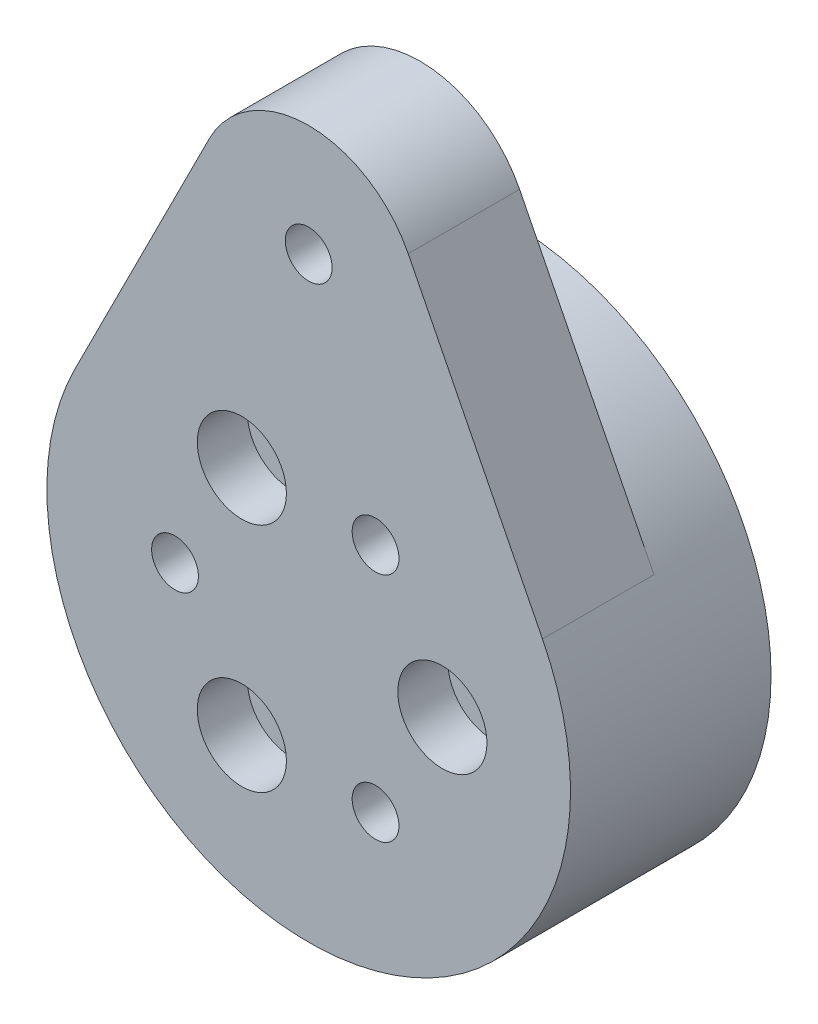
ISO-10303-21;
HEADER;
FILE_DESCRIPTION(('STEP AP214'),'2;1');
FILE_NAME('part.step','',(''),(''),'','','');
FILE_SCHEMA(('AUTOMOTIVE_DESIGN { 1 0 10303 214 1 1 1 1 }'));
ENDSEC;
DATA;
#1=APPLICATION_CONTEXT('core data for automotive mechanical design processes');
#2=APPLICATION_PROTOCOL_DEFINITION('international standard','automotive_design',2000,#1);
#3=PRODUCT_CONTEXT('',#1,'mechanical');
#4=PRODUCT('Part','Part','',(#3));
#5=PRODUCT_RELATED_PRODUCT_CATEGORY('part','',(#4));
#6=PRODUCT_DEFINITION_FORMATION('','',#4);
#7=PRODUCT_DEFINITION_CONTEXT('part definition',#1,'design');
#8=PRODUCT_DEFINITION('design','',#6,#7);
#9=PRODUCT_DEFINITION_SHAPE('','',#8);
#10=(LENGTH_UNIT() NAMED_UNIT(*) SI_UNIT(.MILLI.,.METRE.));
#11=(NAMED_UNIT(*) PLANE_ANGLE_UNIT() SI_UNIT($,.RADIAN.));
#12=(NAMED_UNIT(*) SI_UNIT($,.STERADIAN.) SOLID_ANGLE_UNIT());
#13=UNCERTAINTY_MEASURE_WITH_UNIT(LENGTH_MEASURE(1.E-05),#10,'distance_accuracy_value','');
#14=(GEOMETRIC_REPRESENTATION_CONTEXT(3) GLOBAL_UNCERTAINTY_ASSIGNED_CONTEXT((#13)) GLOBAL_UNIT_ASSIGNED_CONTEXT((#10,
#11,#12)) REPRESENTATION_CONTEXT('',''));
#15=CARTESIAN_POINT('',(0.,0.,0.));
#16=DIRECTION('',(0.,0.,1.));
#17=DIRECTION('',(1.,0.,0.));
#18=AXIS2_PLACEMENT_3D('',#15,#16,#17);
#19=CARTESIAN_POINT('',(12.,0.,0.));
#20=DIRECTION('',(0.,0.,1.));
#21=DIRECTION('',(1.,0.,0.));
#22=AXIS2_PLACEMENT_3D('',#19,#20,#21);
#23=CYLINDRICAL_SURFACE('',#22,2.25);
#24=CARTESIAN_POINT('',(12.,0.,0.));
#25=DIRECTION('',(0.,0.,1.));
#26=DIRECTION('',(1.,0.,0.));
#27=AXIS2_PLACEMENT_3D('',#24,#25,#26);
#28=CIRCLE('',#27,2.25);
#29=CARTESIAN_POINT('',(14.25,0.,0.));
#30=VERTEX_POINT('',#29);
#31=EDGE_CURVE('E127',#30,#30,#28,.T.);
#32=ORIENTED_EDGE('',*,*,#31,.F.);
#33=EDGE_LOOP('',(#32));
#34=FACE_BOUND('',#33,.T.);
#35=CARTESIAN_POINT('',(12.,0.,13.5));
#36=DIRECTION('',(0.,0.,1.));
#37=DIRECTION('',(1.,0.,0.));
#38=AXIS2_PLACEMENT_3D('',#35,#36,#37);
#39=CIRCLE('',#38,2.25);
#40=CARTESIAN_POINT('',(14.25,0.,13.5));
#41=VERTEX_POINT('',#40);
#42=EDGE_CURVE('E45',#41,#41,#39,.F.);
#43=ORIENTED_EDGE('',*,*,#42,.F.);
#44=EDGE_LOOP('',(#43));
#45=FACE_BOUND('',#44,.T.);
#46=ADVANCED_FACE('F41',(#34,#45),#23,.F.);
#47=CARTESIAN_POINT('',(-6.,-10.3923048454133,0.));
#48=DIRECTION('',(0.,0.,1.));
#49=DIRECTION('',(1.,0.,0.));
#50=AXIS2_PLACEMENT_3D('',#47,#48,#49);
#51=CYLINDRICAL_SURFACE('',#50,2.25);
#52=CARTESIAN_POINT('',(-6.,-10.3923048454133,0.));
#53=DIRECTION('',(0.,0.,1.));
#54=DIRECTION('',(1.,0.,0.));
#55=AXIS2_PLACEMENT_3D('',#52,#53,#54);
#56=CIRCLE('',#55,2.25);
#57=CARTESIAN_POINT('',(-3.75,-10.3923048454133,0.));
#58=VERTEX_POINT('',#57);
#59=EDGE_CURVE('E131',#58,#58,#56,.T.);
#60=ORIENTED_EDGE('',*,*,#59,.F.);
#61=EDGE_LOOP('',(#60));
#62=FACE_BOUND('',#61,.T.);
#63=CARTESIAN_POINT('',(-6.,-10.3923048454133,13.5));
#64=DIRECTION('',(0.,0.,1.));
#65=DIRECTION('',(1.,0.,0.));
#66=AXIS2_PLACEMENT_3D('',#63,#64,#65);
#67=CIRCLE('',#66,2.25);
#68=CARTESIAN_POINT('',(-3.75,-10.3923048454133,13.5));
#69=VERTEX_POINT('',#68);
#70=EDGE_CURVE('E121',#69,#69,#67,.F.);
#71=ORIENTED_EDGE('',*,*,#70,.F.);
#72=EDGE_LOOP('',(#71));
#73=FACE_BOUND('',#72,.T.);
#74=ADVANCED_FACE('F224',(#62,#73),#51,.F.);
#75=CARTESIAN_POINT('',(-6.00000000000001,10.3923048454133,0.));
#76=DIRECTION('',(0.,0.,1.));
#77=DIRECTION('',(1.,0.,0.));
#78=AXIS2_PLACEMENT_3D('',#75,#76,#77);
#79=CYLINDRICAL_SURFACE('',#78,2.25);
#80=CARTESIAN_POINT('',(-6.00000000000001,10.3923048454133,0.));
#81=DIRECTION('',(0.,0.,1.));
#82=DIRECTION('',(1.,0.,0.));
#83=AXIS2_PLACEMENT_3D('',#80,#81,#82);
#84=CIRCLE('',#83,2.25);
#85=CARTESIAN_POINT('',(-3.75,10.3923048454133,0.));
#86=VERTEX_POINT('',#85);
#87=EDGE_CURVE('E110',#86,#86,#84,.T.);
#88=ORIENTED_EDGE('',*,*,#87,.F.);
#89=EDGE_LOOP('',(#88));
#90=FACE_BOUND('',#89,.T.);
#91=CARTESIAN_POINT('',(-6.00000000000001,10.3923048454133,13.5));
#92=DIRECTION('',(0.,0.,1.));
#93=DIRECTION('',(1.,0.,0.));
#94=AXIS2_PLACEMENT_3D('',#91,#92,#93);
#95=CIRCLE('',#94,2.25);
#96=CARTESIAN_POINT('',(-3.75,10.3923048454133,13.5));
#97=VERTEX_POINT('',#96);
#98=EDGE_CURVE('E119',#97,#97,#95,.F.);
#99=ORIENTED_EDGE('',*,*,#98,.F.);
#100=EDGE_LOOP('',(#99));
#101=FACE_BOUND('',#100,.T.);
#102=ADVANCED_FACE('F230',(#90,#101),#79,.F.);
#103=CARTESIAN_POINT('',(0.,0.,18.));
#104=DIRECTION('',(0.,0.,-1.));
#105=DIRECTION('',(-1.,0.,0.));
#106=AXIS2_PLACEMENT_3D('',#103,#104,#105);
#107=CYLINDRICAL_SURFACE('',#106,23.5);
#108=CARTESIAN_POINT('',(0.,0.,18.));
#109=DIRECTION('',(0.,0.,1.));
#110=DIRECTION('',(1.,0.,0.));
#111=AXIS2_PLACEMENT_3D('',#108,#109,#110);
#112=CIRCLE('',#111,23.5);
#113=CARTESIAN_POINT('',(-20.9861710419028,10.575,18.));
#114=VERTEX_POINT('',#113);
#115=CARTESIAN_POINT('',(20.9861710419028,10.575,18.));
#116=VERTEX_POINT('',#115);
#117=EDGE_CURVE('E11',#114,#116,#112,.T.);
#118=ORIENTED_EDGE('',*,*,#117,.F.);
#119=DIRECTION('',(0.,0.,1.));
#120=VECTOR('',#119,1.);
#121=CARTESIAN_POINT('',(-20.9861710419028,10.575,8.));
#122=LINE('',#121,#120);
#123=CARTESIAN_POINT('',(-20.9861710419028,10.575,8.));
#124=VERTEX_POINT('',#123);
#125=EDGE_CURVE('E113',#124,#114,#122,.T.);
#126=ORIENTED_EDGE('',*,*,#125,.F.);
#127=CARTESIAN_POINT('',(0.,0.,8.));
#128=DIRECTION('',(0.,0.,1.));
#129=DIRECTION('',(1.,0.,0.));
#130=AXIS2_PLACEMENT_3D('',#127,#128,#129);
#131=CIRCLE('',#130,23.5);
#132=CARTESIAN_POINT('',(20.9861710419028,10.575,8.));
#133=VERTEX_POINT('',#132);
#134=EDGE_CURVE('E66',#133,#124,#131,.T.);
#135=ORIENTED_EDGE('',*,*,#134,.F.);
#136=DIRECTION('',(0.,0.,1.));
#137=VECTOR('',#136,1.);
#138=CARTESIAN_POINT('',(20.9861710419028,10.575,8.));
#139=LINE('',#138,#137);
#140=EDGE_CURVE('E97',#133,#116,#139,.T.);
#141=ORIENTED_EDGE('',*,*,#140,.T.);
#142=EDGE_LOOP('',(#118,#126,#135,#141));
#143=FACE_BOUND('',#142,.T.);
#144=CARTESIAN_POINT('',(0.,0.,0.));
#145=DIRECTION('',(0.,0.,1.));
#146=DIRECTION('',(1.,0.,0.));
#147=AXIS2_PLACEMENT_3D('',#144,#145,#146);
#148=CIRCLE('',#147,23.5);
#149=CARTESIAN_POINT('',(23.5,0.,0.));
#150=VERTEX_POINT('',#149);
#151=EDGE_CURVE('E50',#150,#150,#148,.T.);
#152=ORIENTED_EDGE('',*,*,#151,.T.);
#153=EDGE_LOOP('',(#152));
#154=FACE_BOUND('',#153,.T.);
#155=ADVANCED_FACE('F43',(#143,#154),#107,.T.);
#156=CARTESIAN_POINT('',(0.,0.,18.));
#157=DIRECTION('',(0.,0.,1.));
#158=DIRECTION('',(1.,0.,0.));
#159=AXIS2_PLACEMENT_3D('',#156,#157,#158);
#160=PLANE('',#159);
#161=CARTESIAN_POINT('',(0.,30.,18.));
#162=DIRECTION('',(0.,0.,1.));
#163=DIRECTION('',(1.,0.,0.));
#164=AXIS2_PLACEMENT_3D('',#161,#162,#163);
#165=CIRCLE('',#164,2.1);
#166=CARTESIAN_POINT('',(2.1,30.,18.));
#167=VERTEX_POINT('',#166);
#168=EDGE_CURVE('E176',#167,#167,#165,.T.);
#169=ORIENTED_EDGE('',*,*,#168,.F.);
#170=EDGE_LOOP('',(#169));
#171=FACE_BOUND('',#170,.T.);
#172=CARTESIAN_POINT('',(6.,-10.3923048454133,18.));
#173=DIRECTION('',(0.,0.,1.));
#174=DIRECTION('',(1.,0.,0.));
#175=AXIS2_PLACEMENT_3D('',#172,#173,#174);
#176=CIRCLE('',#175,2.1);
#177=CARTESIAN_POINT('',(8.1,-10.3923048454133,18.));
#178=VERTEX_POINT('',#177);
#179=EDGE_CURVE('E173',#178,#178,#176,.T.);
#180=ORIENTED_EDGE('',*,*,#179,.F.);
#181=EDGE_LOOP('',(#180));
#182=FACE_BOUND('',#181,.T.);
#183=CARTESIAN_POINT('',(-12.,0.,18.));
#184=DIRECTION('',(0.,0.,1.));
#185=DIRECTION('',(1.,0.,0.));
#186=AXIS2_PLACEMENT_3D('',#183,#184,#185);
#187=CIRCLE('',#186,2.1);
#188=CARTESIAN_POINT('',(-9.9,0.,18.));
#189=VERTEX_POINT('',#188);
#190=EDGE_CURVE('E167',#189,#189,#187,.T.);
#191=ORIENTED_EDGE('',*,*,#190,.F.);
#192=EDGE_LOOP('',(#191));
#193=FACE_BOUND('',#192,.T.);
#194=CARTESIAN_POINT('',(6.,10.3923048454133,18.));
#195=DIRECTION('',(0.,0.,1.));
#196=DIRECTION('',(1.,0.,0.));
#197=AXIS2_PLACEMENT_3D('',#194,#195,#196);
#198=CIRCLE('',#197,2.1);
#199=CARTESIAN_POINT('',(8.1,10.3923048454133,18.));
#200=VERTEX_POINT('',#199);
#201=EDGE_CURVE('E161',#200,#200,#198,.T.);
#202=ORIENTED_EDGE('',*,*,#201,.F.);
#203=EDGE_LOOP('',(#202));
#204=FACE_BOUND('',#203,.T.);
#205=CARTESIAN_POINT('',(-6.00000000000001,10.3923048454133,18.));
#206=DIRECTION('',(0.,0.,1.));
#207=DIRECTION('',(1.,0.,0.));
#208=AXIS2_PLACEMENT_3D('',#205,#206,#207);
#209=CIRCLE('',#208,4.);
#210=CARTESIAN_POINT('',(-2.00000000000001,10.3923048454133,18.));
#211=VERTEX_POINT('',#210);
#212=EDGE_CURVE('E153',#211,#211,#209,.T.);
#213=ORIENTED_EDGE('',*,*,#212,.F.);
#214=EDGE_LOOP('',(#213));
#215=FACE_BOUND('',#214,.T.);
#216=CARTESIAN_POINT('',(12.,0.,18.));
#217=DIRECTION('',(0.,0.,1.));
#218=DIRECTION('',(1.,0.,0.));
#219=AXIS2_PLACEMENT_3D('',#216,#217,#218);
#220=CIRCLE('',#219,4.);
#221=CARTESIAN_POINT('',(16.,0.,18.));
#222=VERTEX_POINT('',#221);
#223=EDGE_CURVE('E150',#222,#222,#220,.T.);
#224=ORIENTED_EDGE('',*,*,#223,.F.);
#225=EDGE_LOOP('',(#224));
#226=FACE_BOUND('',#225,.T.);
#227=CARTESIAN_POINT('',(-6.,-10.3923048454133,18.));
#228=DIRECTION('',(0.,0.,1.));
#229=DIRECTION('',(1.,0.,0.));
#230=AXIS2_PLACEMENT_3D('',#227,#228,#229);
#231=CIRCLE('',#230,4.);
#232=CARTESIAN_POINT('',(-2.,-10.3923048454133,18.));
#233=VERTEX_POINT('',#232);
#234=EDGE_CURVE('E143',#233,#233,#231,.T.);
#235=ORIENTED_EDGE('',*,*,#234,.F.);
#236=EDGE_LOOP('',(#235));
#237=FACE_BOUND('',#236,.T.);
#238=ORIENTED_EDGE('',*,*,#117,.T.);
#239=DIRECTION('',(0.45,-0.893028554974588,0.));
#240=VECTOR('',#239,1.);
#241=CARTESIAN_POINT('',(20.9861710419028,10.575,18.));
#242=LINE('',#241,#240);
#243=CARTESIAN_POINT('',(8.93028554974588,34.5,18.));
#244=VERTEX_POINT('',#243);
#245=EDGE_CURVE('E108',#244,#116,#242,.T.);
#246=ORIENTED_EDGE('',*,*,#245,.F.);
#247=CARTESIAN_POINT('',(0.,30.,18.));
#248=DIRECTION('',(0.,0.,1.));
#249=DIRECTION('',(1.,0.,0.));
#250=AXIS2_PLACEMENT_3D('',#247,#248,#249);
#251=CIRCLE('',#250,10.);
#252=CARTESIAN_POINT('',(-8.93028554974588,34.5,18.));
#253=VERTEX_POINT('',#252);
#254=EDGE_CURVE('E94',#244,#253,#251,.T.);
#255=ORIENTED_EDGE('',*,*,#254,.T.);
#256=DIRECTION('',(-0.45,-0.893028554974588,0.));
#257=VECTOR('',#256,1.);
#258=CARTESIAN_POINT('',(-20.9861710419028,10.575,18.));
#259=LINE('',#258,#257);
#260=EDGE_CURVE('E57',#253,#114,#259,.T.);
#261=ORIENTED_EDGE('',*,*,#260,.T.);
#262=EDGE_LOOP('',(#238,#246,#255,#261));
#263=FACE_BOUND('',#262,.T.);
#264=ADVANCED_FACE('F191',(#171,#182,#193,#204,#215,#226,#237,#263),#160,.T.);
#265=CARTESIAN_POINT('',(0.,0.,0.));
#266=DIRECTION('',(0.,0.,1.));
#267=DIRECTION('',(1.,0.,0.));
#268=AXIS2_PLACEMENT_3D('',#265,#266,#267);
#269=PLANE('',#268);
#270=ORIENTED_EDGE('',*,*,#87,.T.);
#271=EDGE_LOOP('',(#270));
#272=FACE_BOUND('',#271,.T.);
#273=ORIENTED_EDGE('',*,*,#59,.T.);
#274=EDGE_LOOP('',(#273));
#275=FACE_BOUND('',#274,.T.);
#276=ORIENTED_EDGE('',*,*,#31,.T.);
#277=EDGE_LOOP('',(#276));
#278=FACE_BOUND('',#277,.T.);
#279=ORIENTED_EDGE('',*,*,#151,.F.);
#280=EDGE_LOOP('',(#279));
#281=FACE_BOUND('',#280,.T.);
#282=ADVANCED_FACE('F194',(#272,#275,#278,#281),#269,.F.);
#283=CARTESIAN_POINT('',(-20.9861710419028,10.575,8.));
#284=DIRECTION('',(-0.893028554974588,0.45,0.));
#285=DIRECTION('',(-0.45,-0.893028554974588,0.));
#286=AXIS2_PLACEMENT_3D('',#283,#284,#285);
#287=PLANE('',#286);
#288=ORIENTED_EDGE('',*,*,#260,.F.);
#289=DIRECTION('',(0.,0.,1.));
#290=VECTOR('',#289,1.);
#291=CARTESIAN_POINT('',(-8.93028554974588,34.5,8.));
#292=LINE('',#291,#290);
#293=CARTESIAN_POINT('',(-8.93028554974588,34.5,8.));
#294=VERTEX_POINT('',#293);
#295=EDGE_CURVE('E84',#294,#253,#292,.T.);
#296=ORIENTED_EDGE('',*,*,#295,.F.);
#297=DIRECTION('',(-0.45,-0.893028554974588,0.));
#298=VECTOR('',#297,1.);
#299=CARTESIAN_POINT('',(-20.9861710419028,10.575,8.));
#300=LINE('',#299,#298);
#301=EDGE_CURVE('E103',#294,#124,#300,.T.);
#302=ORIENTED_EDGE('',*,*,#301,.T.);
#303=ORIENTED_EDGE('',*,*,#125,.T.);
#304=EDGE_LOOP('',(#288,#296,#302,#303));
#305=FACE_BOUND('',#304,.T.);
#306=ADVANCED_FACE('F212',(#305),#287,.T.);
#307=CARTESIAN_POINT('',(0.,30.,8.));
#308=DIRECTION('',(0.,0.,1.));
#309=DIRECTION('',(1.,0.,0.));
#310=AXIS2_PLACEMENT_3D('',#307,#308,#309);
#311=CYLINDRICAL_SURFACE('',#310,10.);
#312=ORIENTED_EDGE('',*,*,#254,.F.);
#313=DIRECTION('',(0.,0.,1.));
#314=VECTOR('',#313,1.);
#315=CARTESIAN_POINT('',(8.93028554974588,34.5,8.));
#316=LINE('',#315,#314);
#317=CARTESIAN_POINT('',(8.93028554974588,34.5,8.));
#318=VERTEX_POINT('',#317);
#319=EDGE_CURVE('E91',#318,#244,#316,.T.);
#320=ORIENTED_EDGE('',*,*,#319,.F.);
#321=CARTESIAN_POINT('',(0.,30.,8.));
#322=DIRECTION('',(0.,0.,1.));
#323=DIRECTION('',(1.,0.,0.));
#324=AXIS2_PLACEMENT_3D('',#321,#322,#323);
#325=CIRCLE('',#324,10.);
#326=EDGE_CURVE('E93',#318,#294,#325,.T.);
#327=ORIENTED_EDGE('',*,*,#326,.T.);
#328=ORIENTED_EDGE('',*,*,#295,.T.);
#329=EDGE_LOOP('',(#312,#320,#327,#328));
#330=FACE_BOUND('',#329,.T.);
#331=ADVANCED_FACE('F92',(#330),#311,.T.);
#332=CARTESIAN_POINT('',(20.9861710419028,10.575,8.));
#333=DIRECTION('',(-0.893028554974588,-0.45,0.));
#334=DIRECTION('',(0.45,-0.893028554974588,0.));
#335=AXIS2_PLACEMENT_3D('',#332,#333,#334);
#336=PLANE('',#335);
#337=ORIENTED_EDGE('',*,*,#245,.T.);
#338=ORIENTED_EDGE('',*,*,#140,.F.);
#339=DIRECTION('',(0.45,-0.893028554974588,0.));
#340=VECTOR('',#339,1.);
#341=CARTESIAN_POINT('',(20.9861710419028,10.575,8.));
#342=LINE('',#341,#340);
#343=EDGE_CURVE('E88',#318,#133,#342,.T.);
#344=ORIENTED_EDGE('',*,*,#343,.F.);
#345=ORIENTED_EDGE('',*,*,#319,.T.);
#346=EDGE_LOOP('',(#337,#338,#344,#345));
#347=FACE_BOUND('',#346,.T.);
#348=ADVANCED_FACE('F99',(#347),#336,.F.);
#349=CARTESIAN_POINT('',(0.,0.,8.));
#350=DIRECTION('',(0.,0.,1.));
#351=DIRECTION('',(1.,0.,0.));
#352=AXIS2_PLACEMENT_3D('',#349,#350,#351);
#353=PLANE('',#352);
#354=ORIENTED_EDGE('',*,*,#134,.T.);
#355=ORIENTED_EDGE('',*,*,#301,.F.);
#356=ORIENTED_EDGE('',*,*,#326,.F.);
#357=ORIENTED_EDGE('',*,*,#343,.T.);
#358=EDGE_LOOP('',(#354,#355,#356,#357));
#359=FACE_BOUND('',#358,.T.);
#360=ADVANCED_FACE('F102',(#359),#353,.F.);
#361=CARTESIAN_POINT('',(-6.00000000000001,10.3923048454133,13.5));
#362=DIRECTION('',(0.,0.,1.));
#363=DIRECTION('',(1.,0.,0.));
#364=AXIS2_PLACEMENT_3D('',#361,#362,#363);
#365=PLANE('',#364);
#366=CARTESIAN_POINT('',(-6.00000000000001,10.3923048454133,13.5));
#367=DIRECTION('',(0.,0.,1.));
#368=DIRECTION('',(1.,0.,0.));
#369=AXIS2_PLACEMENT_3D('',#366,#367,#368);
#370=CIRCLE('',#369,4.);
#371=CARTESIAN_POINT('',(-2.00000000000001,10.3923048454133,13.5));
#372=VERTEX_POINT('',#371);
#373=EDGE_CURVE('E122',#372,#372,#370,.T.);
#374=ORIENTED_EDGE('',*,*,#373,.T.);
#375=EDGE_LOOP('',(#374));
#376=FACE_BOUND('',#375,.T.);
#377=ORIENTED_EDGE('',*,*,#98,.T.);
#378=EDGE_LOOP('',(#377));
#379=FACE_BOUND('',#378,.T.);
#380=ADVANCED_FACE('F236',(#376,#379),#365,.T.);
#381=CARTESIAN_POINT('',(-6.00000000000001,10.3923048454133,13.5));
#382=DIRECTION('',(0.,0.,1.));
#383=DIRECTION('',(1.,0.,0.));
#384=AXIS2_PLACEMENT_3D('',#381,#382,#383);
#385=CYLINDRICAL_SURFACE('',#384,4.);
#386=ORIENTED_EDGE('',*,*,#373,.F.);
#387=EDGE_LOOP('',(#386));
#388=FACE_BOUND('',#387,.T.);
#389=ORIENTED_EDGE('',*,*,#212,.T.);
#390=EDGE_LOOP('',(#389));
#391=FACE_BOUND('',#390,.T.);
#392=ADVANCED_FACE('F241',(#388,#391),#385,.F.);
#393=CARTESIAN_POINT('',(-6.,-10.3923048454133,13.5));
#394=DIRECTION('',(0.,0.,1.));
#395=DIRECTION('',(1.,0.,0.));
#396=AXIS2_PLACEMENT_3D('',#393,#394,#395);
#397=PLANE('',#396);
#398=CARTESIAN_POINT('',(-6.,-10.3923048454133,13.5));
#399=DIRECTION('',(0.,0.,1.));
#400=DIRECTION('',(1.,0.,0.));
#401=AXIS2_PLACEMENT_3D('',#398,#399,#400);
#402=CIRCLE('',#401,4.);
#403=CARTESIAN_POINT('',(-2.,-10.3923048454133,13.5));
#404=VERTEX_POINT('',#403);
#405=EDGE_CURVE('E140',#404,#404,#402,.T.);
#406=ORIENTED_EDGE('',*,*,#405,.T.);
#407=EDGE_LOOP('',(#406));
#408=FACE_BOUND('',#407,.T.);
#409=ORIENTED_EDGE('',*,*,#70,.T.);
#410=EDGE_LOOP('',(#409));
#411=FACE_BOUND('',#410,.T.);
#412=ADVANCED_FACE('F368',(#408,#411),#397,.T.);
#413=CARTESIAN_POINT('',(-6.,-10.3923048454133,13.5));
#414=DIRECTION('',(0.,0.,1.));
#415=DIRECTION('',(1.,0.,0.));
#416=AXIS2_PLACEMENT_3D('',#413,#414,#415);
#417=CYLINDRICAL_SURFACE('',#416,4.);
#418=ORIENTED_EDGE('',*,*,#405,.F.);
#419=EDGE_LOOP('',(#418));
#420=FACE_BOUND('',#419,.T.);
#421=ORIENTED_EDGE('',*,*,#234,.T.);
#422=EDGE_LOOP('',(#421));
#423=FACE_BOUND('',#422,.T.);
#424=ADVANCED_FACE('F359',(#420,#423),#417,.F.);
#425=CARTESIAN_POINT('',(12.,0.,13.5));
#426=DIRECTION('',(0.,0.,1.));
#427=DIRECTION('',(1.,0.,0.));
#428=AXIS2_PLACEMENT_3D('',#425,#426,#427);
#429=PLANE('',#428);
#430=CARTESIAN_POINT('',(12.,0.,13.5));
#431=DIRECTION('',(0.,0.,1.));
#432=DIRECTION('',(1.,0.,0.));
#433=AXIS2_PLACEMENT_3D('',#430,#431,#432);
#434=CIRCLE('',#433,4.);
#435=CARTESIAN_POINT('',(16.,0.,13.5));
#436=VERTEX_POINT('',#435);
#437=EDGE_CURVE('E147',#436,#436,#434,.T.);
#438=ORIENTED_EDGE('',*,*,#437,.T.);
#439=EDGE_LOOP('',(#438));
#440=FACE_BOUND('',#439,.T.);
#441=ORIENTED_EDGE('',*,*,#42,.T.);
#442=EDGE_LOOP('',(#441));
#443=FACE_BOUND('',#442,.T.);
#444=ADVANCED_FACE('F351',(#440,#443),#429,.T.);
#445=CARTESIAN_POINT('',(12.,0.,13.5));
#446=DIRECTION('',(0.,0.,1.));
#447=DIRECTION('',(1.,0.,0.));
#448=AXIS2_PLACEMENT_3D('',#445,#446,#447);
#449=CYLINDRICAL_SURFACE('',#448,4.);
#450=ORIENTED_EDGE('',*,*,#437,.F.);
#451=EDGE_LOOP('',(#450));
#452=FACE_BOUND('',#451,.T.);
#453=ORIENTED_EDGE('',*,*,#223,.T.);
#454=EDGE_LOOP('',(#453));
#455=FACE_BOUND('',#454,.T.);
#456=ADVANCED_FACE('F272',(#452,#455),#449,.F.);
#457=CARTESIAN_POINT('',(6.,10.3923048454133,12.3));
#458=DIRECTION('',(0.,0.,1.));
#459=DIRECTION('',(1.,0.,0.));
#460=AXIS2_PLACEMENT_3D('',#457,#458,#459);
#461=CYLINDRICAL_SURFACE('',#460,2.1);
#462=CARTESIAN_POINT('',(6.,10.3923048454133,12.3));
#463=DIRECTION('',(0.,0.,1.));
#464=DIRECTION('',(1.,0.,0.));
#465=AXIS2_PLACEMENT_3D('',#462,#463,#464);
#466=CIRCLE('',#465,2.1);
#467=CARTESIAN_POINT('',(8.1,10.3923048454133,12.3));
#468=VERTEX_POINT('',#467);
#469=EDGE_CURVE('E158',#468,#468,#466,.T.);
#470=ORIENTED_EDGE('',*,*,#469,.F.);
#471=EDGE_LOOP('',(#470));
#472=FACE_BOUND('',#471,.T.);
#473=ORIENTED_EDGE('',*,*,#201,.T.);
#474=EDGE_LOOP('',(#473));
#475=FACE_BOUND('',#474,.T.);
#476=ADVANCED_FACE('F276',(#472,#475),#461,.F.);
#477=CARTESIAN_POINT('',(6.,10.3923048454133,12.3));
#478=DIRECTION('',(0.,0.,1.));
#479=DIRECTION('',(1.,0.,0.));
#480=AXIS2_PLACEMENT_3D('',#477,#478,#479);
#481=PLANE('',#480);
#482=ORIENTED_EDGE('',*,*,#469,.T.);
#483=EDGE_LOOP('',(#482));
#484=FACE_BOUND('',#483,.T.);
#485=ADVANCED_FACE('F280',(#484),#481,.T.);
#486=CARTESIAN_POINT('',(-12.,0.,12.3));
#487=DIRECTION('',(0.,0.,1.));
#488=DIRECTION('',(1.,0.,0.));
#489=AXIS2_PLACEMENT_3D('',#486,#487,#488);
#490=CYLINDRICAL_SURFACE('',#489,2.1);
#491=CARTESIAN_POINT('',(-12.,0.,12.3));
#492=DIRECTION('',(0.,0.,1.));
#493=DIRECTION('',(1.,0.,0.));
#494=AXIS2_PLACEMENT_3D('',#491,#492,#493);
#495=CIRCLE('',#494,2.1);
#496=CARTESIAN_POINT('',(-9.9,0.,12.3));
#497=VERTEX_POINT('',#496);
#498=EDGE_CURVE('E164',#497,#497,#495,.T.);
#499=ORIENTED_EDGE('',*,*,#498,.F.);
#500=EDGE_LOOP('',(#499));
#501=FACE_BOUND('',#500,.T.);
#502=ORIENTED_EDGE('',*,*,#190,.T.);
#503=EDGE_LOOP('',(#502));
#504=FACE_BOUND('',#503,.T.);
#505=ADVANCED_FACE('F289',(#501,#504),#490,.F.);
#506=CARTESIAN_POINT('',(-12.,0.,12.3));
#507=DIRECTION('',(0.,0.,1.));
#508=DIRECTION('',(1.,0.,0.));
#509=AXIS2_PLACEMENT_3D('',#506,#507,#508);
#510=PLANE('',#509);
#511=ORIENTED_EDGE('',*,*,#498,.T.);
#512=EDGE_LOOP('',(#511));
#513=FACE_BOUND('',#512,.T.);
#514=ADVANCED_FACE('F298',(#513),#510,.T.);
#515=CARTESIAN_POINT('',(6.,-10.3923048454133,12.3));
#516=DIRECTION('',(0.,0.,1.));
#517=DIRECTION('',(1.,0.,0.));
#518=AXIS2_PLACEMENT_3D('',#515,#516,#517);
#519=CYLINDRICAL_SURFACE('',#518,2.1);
#520=CARTESIAN_POINT('',(6.,-10.3923048454133,12.3));
#521=DIRECTION('',(0.,0.,1.));
#522=DIRECTION('',(1.,0.,0.));
#523=AXIS2_PLACEMENT_3D('',#520,#521,#522);
#524=CIRCLE('',#523,2.1);
#525=CARTESIAN_POINT('',(8.1,-10.3923048454133,12.3));
#526=VERTEX_POINT('',#525);
#527=EDGE_CURVE('E170',#526,#526,#524,.T.);
#528=ORIENTED_EDGE('',*,*,#527,.F.);
#529=EDGE_LOOP('',(#528));
#530=FACE_BOUND('',#529,.T.);
#531=ORIENTED_EDGE('',*,*,#179,.T.);
#532=EDGE_LOOP('',(#531));
#533=FACE_BOUND('',#532,.T.);
#534=ADVANCED_FACE('F307',(#530,#533),#519,.F.);
#535=CARTESIAN_POINT('',(6.,-10.3923048454133,12.3));
#536=DIRECTION('',(0.,0.,1.));
#537=DIRECTION('',(1.,0.,0.));
#538=AXIS2_PLACEMENT_3D('',#535,#536,#537);
#539=PLANE('',#538);
#540=ORIENTED_EDGE('',*,*,#527,.T.);
#541=EDGE_LOOP('',(#540));
#542=FACE_BOUND('',#541,.T.);
#543=ADVANCED_FACE('F187',(#542),#539,.T.);
#544=CARTESIAN_POINT('',(0.,30.,12.3));
#545=DIRECTION('',(0.,0.,1.));
#546=DIRECTION('',(1.,0.,0.));
#547=AXIS2_PLACEMENT_3D('',#544,#545,#546);
#548=CYLINDRICAL_SURFACE('',#547,2.1);
#549=CARTESIAN_POINT('',(0.,30.,12.3));
#550=DIRECTION('',(0.,0.,1.));
#551=DIRECTION('',(1.,0.,0.));
#552=AXIS2_PLACEMENT_3D('',#549,#550,#551);
#553=CIRCLE('',#552,2.1);
#554=CARTESIAN_POINT('',(2.1,30.,12.3));
#555=VERTEX_POINT('',#554);
#556=EDGE_CURVE('E144',#555,#555,#553,.T.);
#557=ORIENTED_EDGE('',*,*,#556,.F.);
#558=EDGE_LOOP('',(#557));
#559=FACE_BOUND('',#558,.T.);
#560=ORIENTED_EDGE('',*,*,#168,.T.);
#561=EDGE_LOOP('',(#560));
#562=FACE_BOUND('',#561,.T.);
#563=ADVANCED_FACE('F184',(#559,#562),#548,.F.);
#564=CARTESIAN_POINT('',(0.,30.,12.3));
#565=DIRECTION('',(0.,0.,1.));
#566=DIRECTION('',(1.,0.,0.));
#567=AXIS2_PLACEMENT_3D('',#564,#565,#566);
#568=PLANE('',#567);
#569=ORIENTED_EDGE('',*,*,#556,.T.);
#570=EDGE_LOOP('',(#569));
#571=FACE_BOUND('',#570,.T.);
#572=ADVANCED_FACE('F182',(#571),#568,.T.);
#573=CLOSED_SHELL('',(#46,#74,#102,#155,#264,#282,#306,#331,#348,#360,#380,#392,#412,#424,#444,
#456,#476,#485,#505,#514,#534,#543,#563,#572));
#574=MANIFOLD_SOLID_BREP('B2',#573);
#575=ADVANCED_BREP_SHAPE_REPRESENTATION('',(#18,#574),#14);
#576=SHAPE_DEFINITION_REPRESENTATION(#9,#575);
ENDSEC;
END-ISO-10303-21;
